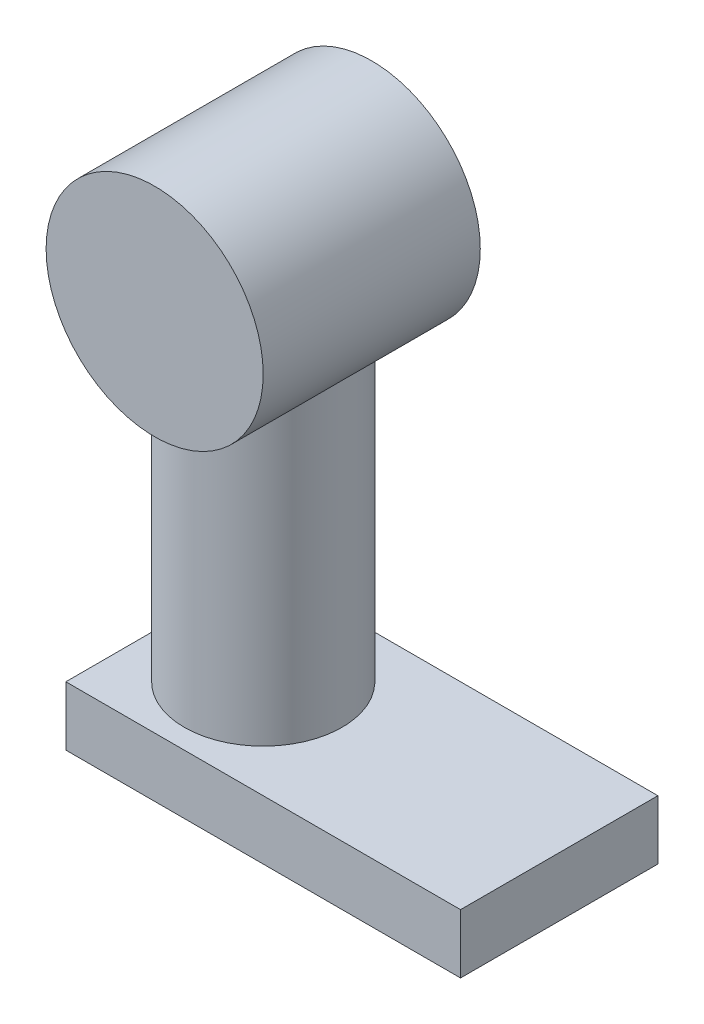
ISO-10303-21;
HEADER;
FILE_DESCRIPTION(('STEP AP214'),'2;1');
FILE_NAME('part.step','',(''),(''),'','','');
FILE_SCHEMA(('AUTOMOTIVE_DESIGN { 1 0 10303 214 1 1 1 1 }'));
ENDSEC;
DATA;
#1=APPLICATION_CONTEXT('core data for automotive mechanical design processes');
#2=APPLICATION_PROTOCOL_DEFINITION('international standard','automotive_design',2000,#1);
#3=PRODUCT_CONTEXT('',#1,'mechanical');
#4=PRODUCT('Part','Part','',(#3));
#5=PRODUCT_RELATED_PRODUCT_CATEGORY('part','',(#4));
#6=PRODUCT_DEFINITION_FORMATION('','',#4);
#7=PRODUCT_DEFINITION_CONTEXT('part definition',#1,'design');
#8=PRODUCT_DEFINITION('design','',#6,#7);
#9=PRODUCT_DEFINITION_SHAPE('','',#8);
#10=(LENGTH_UNIT() NAMED_UNIT(*) SI_UNIT(.MILLI.,.METRE.));
#11=(NAMED_UNIT(*) PLANE_ANGLE_UNIT() SI_UNIT($,.RADIAN.));
#12=(NAMED_UNIT(*) SI_UNIT($,.STERADIAN.) SOLID_ANGLE_UNIT());
#13=UNCERTAINTY_MEASURE_WITH_UNIT(LENGTH_MEASURE(1.E-05),#10,'distance_accuracy_value','');
#14=(GEOMETRIC_REPRESENTATION_CONTEXT(3) GLOBAL_UNCERTAINTY_ASSIGNED_CONTEXT((#13)) GLOBAL_UNIT_ASSIGNED_CONTEXT((#10,
#11,#12)) REPRESENTATION_CONTEXT('',''));
#15=CARTESIAN_POINT('',(0.,0.,0.));
#16=DIRECTION('',(0.,0.,1.));
#17=DIRECTION('',(1.,0.,0.));
#18=AXIS2_PLACEMENT_3D('',#15,#16,#17);
#19=CARTESIAN_POINT('',(0.,190.,0.));
#20=DIRECTION('',(0.,-1.,0.));
#21=DIRECTION('',(0.,0.,-1.));
#22=AXIS2_PLACEMENT_3D('',#19,#20,#21);
#23=CYLINDRICAL_SURFACE('',#22,40.);
#24=CARTESIAN_POINT('',(0.,0.,0.));
#25=DIRECTION('',(0.,1.,0.));
#26=DIRECTION('',(0.,0.,1.));
#27=AXIS2_PLACEMENT_3D('',#24,#25,#26);
#28=CIRCLE('',#27,40.);
#29=CARTESIAN_POINT('',(0.,0.,40.));
#30=VERTEX_POINT('',#29);
#31=EDGE_CURVE('E112',#30,#30,#28,.T.);
#32=ORIENTED_EDGE('',*,*,#31,.T.);
#33=EDGE_LOOP('',(#32));
#34=FACE_BOUND('',#33,.T.);
#35=CARTESIAN_POINT('',(0.,135.,-40.));
#36=CARTESIAN_POINT('',(-0.984083742583215,135.00000931002,-39.9999902940931));
#37=CARTESIAN_POINT('',(-1.96845942739344,135.026477726352,-39.9636172994544));
#38=CARTESIAN_POINT('',(-3.92950238920122,135.131754045187,-39.8186742661435));
#39=CARTESIAN_POINT('',(-4.90616440624865,135.21059498677,-39.710058653338));
#40=CARTESIAN_POINT('',(-6.84582731507095,135.418976216816,-39.4220504754723));
#41=CARTESIAN_POINT('',(-7.80879149667945,135.548633037736,-39.2424952218764));
#42=CARTESIAN_POINT('',(-9.71153540172042,135.855611311634,-38.8154201060335));
#43=CARTESIAN_POINT('',(-10.6513184569501,136.032925870721,-38.5679100736179));
#44=CARTESIAN_POINT('',(-12.4963105620617,136.430162785462,-38.0100717683725));
#45=CARTESIAN_POINT('',(-13.4016930494896,136.649823445595,-37.700128823306));
#46=CARTESIAN_POINT('',(-15.1790040897252,137.128033142359,-37.0203084816768));
#47=CARTESIAN_POINT('',(-16.0509315371191,137.386583462586,-36.650429106814));
#48=CARTESIAN_POINT('',(-17.7571209880402,137.937652462975,-35.8548505946256));
#49=CARTESIAN_POINT('',(-18.5914017135284,138.230153994568,-35.4291796234091));
#50=CARTESIAN_POINT('',(-20.2199651194613,138.844252470265,-34.5256472619918));
#51=CARTESIAN_POINT('',(-21.0142462581761,139.16585053452,-34.0477838623506));
#52=CARTESIAN_POINT('',(-22.631052601757,139.863392638969,-32.9976851621558));
#53=CARTESIAN_POINT('',(-23.4495841858654,140.241619495102,-32.4208200787252));
#54=CARTESIAN_POINT('',(-25.0346902011095,141.019962768002,-31.2130949131306));
#55=CARTESIAN_POINT('',(-25.8012619287169,141.420080321811,-30.5822320252603));
#56=CARTESIAN_POINT('',(-27.2821499067781,142.235997246288,-29.2688447421776));
#57=CARTESIAN_POINT('',(-27.996388019762,142.651818715559,-28.5862460735351));
#58=CARTESIAN_POINT('',(-29.3702474616727,143.491539891531,-27.1727812991901));
#59=CARTESIAN_POINT('',(-30.0298658311716,143.915440034425,-26.4419125819533));
#60=CARTESIAN_POINT('',(-31.4141225424035,144.845000081378,-24.7896373262374));
#61=CARTESIAN_POINT('',(-32.1271031211005,145.350806206186,-23.8585070711959));
#62=CARTESIAN_POINT('',(-33.4716857253963,146.349709637656,-21.9323097161551));
#63=CARTESIAN_POINT('',(-34.1032646337419,146.842803302445,-20.9372245733254));
#64=CARTESIAN_POINT('',(-35.2806140590628,147.799845645979,-18.8858513883336));
#65=CARTESIAN_POINT('',(-35.8264831889204,148.263827444503,-17.8296356240472));
#66=CARTESIAN_POINT('',(-36.8279330348017,149.144794049643,-15.6567168894765));
#67=CARTESIAN_POINT('',(-37.2835638539282,149.561804880206,-14.5400479257497));
#68=CARTESIAN_POINT('',(-37.9634375817883,150.201530633696,-12.6270123793094));
#69=CARTESIAN_POINT('',(-38.2144533844756,150.442989368965,-11.8463520634355));
#70=CARTESIAN_POINT('',(-38.6702526996236,150.888452932553,-10.2611573045912));
#71=CARTESIAN_POINT('',(-38.8750434890422,151.092463655167,-9.45662664199647));
#72=CARTESIAN_POINT('',(-39.2353395209577,151.455821931767,-7.82828206720554));
#73=CARTESIAN_POINT('',(-39.3909383879847,151.615254261888,-7.00450802993215));
#74=CARTESIAN_POINT('',(-39.6507989208522,151.883740755421,-5.34068387646976));
#75=CARTESIAN_POINT('',(-39.7550607645902,151.992795093407,-4.50063381669228));
#76=CARTESIAN_POINT('',(-39.9107642108996,152.156322682179,-2.80391056159339));
#77=CARTESIAN_POINT('',(-39.9618059424068,152.210382658279,-1.94716010557524));
#78=CARTESIAN_POINT('',(-40.0085507064504,152.259874475409,-0.230466459762982));
#79=CARTESIAN_POINT('',(-40.0042557612266,152.255308458885,0.629476612211085));
#80=CARTESIAN_POINT('',(-39.9404088821416,152.187755426789,2.34551841233593));
#81=CARTESIAN_POINT('',(-39.8808219208721,152.124731378153,3.20161435785249));
#82=CARTESIAN_POINT('',(-39.7076543470777,151.943230286969,4.90236277794477));
#83=CARTESIAN_POINT('',(-39.5940676877472,151.824747034206,5.74701396005593));
#84=CARTESIAN_POINT('',(-39.2990373119382,151.520973876187,7.51524446966263));
#85=CARTESIAN_POINT('',(-39.1112864884088,151.329562716877,8.43671416587171));
#86=CARTESIAN_POINT('',(-38.6751332683911,150.893365459594,10.2521301425451));
#87=CARTESIAN_POINT('',(-38.4267220687047,150.648571615132,11.1460724069307));
#88=CARTESIAN_POINT('',(-37.8725438216816,150.114934113766,12.9043335808587));
#89=CARTESIAN_POINT('',(-37.5666678432927,149.826006994917,13.7685924801178));
#90=CARTESIAN_POINT('',(-36.9013028846565,149.213994637341,15.4636044217148));
#91=CARTESIAN_POINT('',(-36.5418088728726,148.890906193731,16.2943543102495));
#92=CARTESIAN_POINT('',(-35.6423591066096,148.106231415448,18.1953233291892));
#93=CARTESIAN_POINT('',(-35.082398351468,147.634642618324,19.2519831363343));
#94=CARTESIAN_POINT('',(-33.876710130668,146.664474317796,21.3021949189188));
#95=CARTESIAN_POINT('',(-33.2309560065999,146.165886453668,22.2957271364158));
#96=CARTESIAN_POINT('',(-31.8565576842253,145.157084038986,24.2189540117851));
#97=CARTESIAN_POINT('',(-31.1278393640127,144.646859422508,25.1485903758414));
#98=CARTESIAN_POINT('',(-29.5904581506682,143.629161449883,26.9406440874283));
#99=CARTESIAN_POINT('',(-28.7818040759834,143.121687796754,27.8030688309587));
#100=CARTESIAN_POINT('',(-27.0756276983558,142.115727434694,29.4677573969908));
#101=CARTESIAN_POINT('',(-26.1771088456024,141.617436182904,30.2691200546357));
#102=CARTESIAN_POINT('',(-24.3020076221987,140.648952399852,31.7942250097455));
#103=CARTESIAN_POINT('',(-23.3254171001158,140.178762811654,32.5179591835286));
#104=CARTESIAN_POINT('',(-21.2993116621298,139.279536450253,33.879582855428));
#105=CARTESIAN_POINT('',(-20.2499423300872,138.850421387195,34.5176366392099));
#106=CARTESIAN_POINT('',(-18.0814849277242,138.044284445287,35.7013186746624));
#107=CARTESIAN_POINT('',(-16.962423316767,137.667242969022,36.2469817143061));
#108=CARTESIAN_POINT('',(-14.9567858102839,137.065201060577,37.1101366083102));
#109=CARTESIAN_POINT('',(-14.0841401929184,136.826000918132,37.4502634620062));
#110=CARTESIAN_POINT('',(-12.3082472760284,136.38709968006,38.070871883185));
#111=CARTESIAN_POINT('',(-11.4050048959485,136.18739226964,38.3513629868175));
#112=CARTESIAN_POINT('',(-9.57336125295663,135.831553121726,38.8490784253834));
#113=CARTESIAN_POINT('',(-8.64497418554997,135.67539733731,39.0663376765226));
#114=CARTESIAN_POINT('',(-6.76851043278085,135.409844746621,39.4347737290875));
#115=CARTESIAN_POINT('',(-5.8204332271617,135.300449177508,39.5859487820907));
#116=CARTESIAN_POINT('',(-3.90794254843092,135.130582967944,39.8203401182266));
#117=CARTESIAN_POINT('',(-2.94348159997997,135.070294902464,39.9033028077818));
#118=CARTESIAN_POINT('',(-1.00923210454746,135.000745972243,39.9989878625757));
#119=CARTESIAN_POINT('',(-0.0394435668258442,134.99148501884,40.0117103498608));
#120=CARTESIAN_POINT('',(1.89766015896868,135.024211414067,39.9667056829631));
#121=CARTESIAN_POINT('',(2.86497523777325,135.06620098886,39.9089754685338));
#122=CARTESIAN_POINT('',(4.78937055776542,135.200435850959,39.7240013089528));
#123=CARTESIAN_POINT('',(5.74645106502032,135.29267982855,39.5967591753979));
#124=CARTESIAN_POINT('',(7.58961083164942,135.518711207721,39.2838618546934));
#125=CARTESIAN_POINT('',(8.47664865263909,135.649860065937,39.1019088152028));
#126=CARTESIAN_POINT('',(10.2298040660314,135.952406439841,38.6802782631014));
#127=CARTESIAN_POINT('',(11.0959226209245,136.123802099878,38.4406034118457));
#128=CARTESIAN_POINT('',(12.8027307734777,136.503695060635,37.9063308163766));
#129=CARTESIAN_POINT('',(13.6434179457767,136.712195887062,37.6117278528059));
#130=CARTESIAN_POINT('',(15.295516076482,137.16269823467,36.970697005011));
#131=CARTESIAN_POINT('',(16.1069253549971,137.404701674306,36.6242661528844));
#132=CARTESIAN_POINT('',(17.7638044914856,137.939775235136,35.8517920938781));
#133=CARTESIAN_POINT('',(18.6064683615178,138.235421347321,35.4215182267594));
#134=CARTESIAN_POINT('',(20.2509483317926,138.856361449487,34.5077400843411));
#135=CARTESIAN_POINT('',(21.0527625915953,139.181656773446,34.0242334137857));
#136=CARTESIAN_POINT('',(22.6138226265481,139.856819190583,33.0073213619786));
#137=CARTESIAN_POINT('',(23.3730464529004,140.206698747693,32.4738906236204));
#138=CARTESIAN_POINT('',(24.8469765033225,140.925564421138,31.3604996853284));
#139=CARTESIAN_POINT('',(25.5616804001884,141.294551534444,30.7805370566386));
#140=CARTESIAN_POINT('',(27.0720164439221,142.115000637728,29.4666380253121));
#141=CARTESIAN_POINT('',(27.858550782706,142.569206386649,28.7239380728747));
#142=CARTESIAN_POINT('',(29.3663192451618,143.487649902064,27.1805720348684));
#143=CARTESIAN_POINT('',(30.0875430273704,143.951889242943,26.3798968053211));
#144=CARTESIAN_POINT('',(31.4636435001538,144.880948701106,24.7224655459643));
#145=CARTESIAN_POINT('',(32.1184669911531,145.345768986702,23.865665439747));
#146=CARTESIAN_POINT('',(33.3591481305627,146.264854286642,22.0982543018373));
#147=CARTESIAN_POINT('',(33.9450152265263,146.719120740079,21.1876506673768));
#148=CARTESIAN_POINT('',(34.978944960672,147.551684178397,19.4264457959636));
#149=CARTESIAN_POINT('',(35.435106650534,147.932545020811,18.5818097841104));
#150=CARTESIAN_POINT('',(36.2895403121949,148.667364942148,16.8522842226466));
#151=CARTESIAN_POINT('',(36.6878107233613,149.021323295712,15.9673935886964));
#152=CARTESIAN_POINT('',(37.4224543500141,149.691109320759,14.1601455344872));
#153=CARTESIAN_POINT('',(37.7589318409651,150.0070009142,13.237854499644));
#154=CARTESIAN_POINT('',(38.3666088586499,150.589585726889,11.3569021294121));
#155=CARTESIAN_POINT('',(38.6378274693497,150.856293323905,10.3982515219909));
#156=CARTESIAN_POINT('',(39.0594306885389,151.277531537531,8.6591000987915));
#157=CARTESIAN_POINT('',(39.2232591370243,151.44385062163,7.88470267284146));
#158=CARTESIAN_POINT('',(39.5056120989986,151.733204668429,6.31969220988486));
#159=CARTESIAN_POINT('',(39.6241426000355,151.856245351559,5.52908133056268));
#160=CARTESIAN_POINT('',(39.8138223571939,152.054269677287,3.93715998360442));
#161=CARTESIAN_POINT('',(39.8850293180351,152.129311843436,3.13586376660023));
#162=CARTESIAN_POINT('',(39.9789514192686,152.228473876246,1.527244723669));
#163=CARTESIAN_POINT('',(40.0016662593813,152.252593427579,0.719921860454019));
#164=CARTESIAN_POINT('',(39.9981406394522,152.248857605241,-0.895698968093946));
#165=CARTESIAN_POINT('',(39.9718271928458,152.220924743095,-1.70399659420351));
#166=CARTESIAN_POINT('',(39.870634337519,152.114147204286,-3.31410431881588));
#167=CARTESIAN_POINT('',(39.7957551057039,152.035302713075,-4.11591444093923));
#168=CARTESIAN_POINT('',(39.5987022171097,151.829816016219,-5.70855235496697));
#169=CARTESIAN_POINT('',(39.4764644506807,151.703109024543,-6.49936374807431));
#170=CARTESIAN_POINT('',(39.1867177267001,151.406685033963,-8.06441906469509));
#171=CARTESIAN_POINT('',(39.0192025550863,151.236962131574,-8.83866069835263));
#172=CARTESIAN_POINT('',(38.5835505523884,150.802667778316,-10.6002223377417));
#173=CARTESIAN_POINT('',(38.30030677156,150.52495346972,-11.5805831215977));
#174=CARTESIAN_POINT('',(37.6656268807619,149.918922164229,-13.502816267676));
#175=CARTESIAN_POINT('',(37.3141677400959,149.590588084937,-14.4446755007234));
#176=CARTESIAN_POINT('',(36.5469985672202,148.895436966274,-16.2885006027404));
#177=CARTESIAN_POINT('',(36.1312071906264,148.52857139735,-17.1904140793396));
#178=CARTESIAN_POINT('',(35.2392312936875,147.768020603174,-18.9518120635604));
#179=CARTESIAN_POINT('',(34.7630508771011,147.374337201178,-19.811299448754));
#180=CARTESIAN_POINT('',(33.7380714559816,146.558267131412,-21.5117820129858));
#181=CARTESIAN_POINT('',(33.1875535381244,146.135377433132,-22.3514975324299));
#182=CARTESIAN_POINT('',(32.0273357100645,145.281225587644,-23.9844304323203));
#183=CARTESIAN_POINT('',(31.4176359117793,144.84996345627,-24.7776479006934));
#184=CARTESIAN_POINT('',(30.140308856891,143.987437656096,-26.3165732591513));
#185=CARTESIAN_POINT('',(29.4726609046776,143.556174042209,-27.0622640092717));
#186=CARTESIAN_POINT('',(28.08078651305,142.70162259996,-28.5039189650456));
#187=CARTESIAN_POINT('',(27.356553951291,142.278335640824,-29.1998777741589));
#188=CARTESIAN_POINT('',(25.688944964575,141.356681269118,-30.6852050863007));
#189=CARTESIAN_POINT('',(24.7321824359606,140.86202725013,-31.4619300023669));
#190=CARTESIAN_POINT('',(22.7387857444067,139.908404677621,-32.9314483813547));
#191=CARTESIAN_POINT('',(21.7021336687295,139.449444173876,-33.6242229309275));
#192=CARTESIAN_POINT('',(20.0914793142173,138.797772478309,-34.5937134750296));
#193=CARTESIAN_POINT('',(19.5454905018004,138.586735636116,-34.9051805606355));
#194=CARTESIAN_POINT('',(18.4354779314548,138.17835729786,-35.5039526318117));
#195=CARTESIAN_POINT('',(17.8714568082006,137.981013814317,-35.7912611250919));
#196=CARTESIAN_POINT('',(16.7264205671935,137.601617509656,-36.3404717059895));
#197=CARTESIAN_POINT('',(16.1454116160143,137.419559230686,-36.6023828673942));
#198=CARTESIAN_POINT('',(14.9673578077662,137.072168208494,-37.0996902294464));
#199=CARTESIAN_POINT('',(14.3703145602433,136.906833794389,-37.3350890792085));
#200=CARTESIAN_POINT('',(12.900977409113,136.526996169125,-37.8736421425356));
#201=CARTESIAN_POINT('',(12.0208457381668,136.321970172309,-38.1623342945053));
#202=CARTESIAN_POINT('',(10.2347095879488,135.952961913456,-38.679648092251));
#203=CARTESIAN_POINT('',(9.32870585941996,135.788978461812,-38.9082714791137));
#204=CARTESIAN_POINT('',(7.4986639194961,135.505733569173,-39.3019556815652));
#205=CARTESIAN_POINT('',(6.57468004541536,135.386354414124,-39.4671838333671));
#206=CARTESIAN_POINT('',(4.71295523004042,135.194317811035,-39.7324960310419));
#207=CARTESIAN_POINT('',(3.77522205318846,135.121634959125,-39.8326154979086));
#208=CARTESIAN_POINT('',(2.36296728113428,135.04875476846,-39.9329410764714));
#209=CARTESIAN_POINT('',(1.89097331721055,135.030485290341,-39.9580740893672));
#210=CARTESIAN_POINT('',(0.946008813273771,135.00610473886,-39.9916071633038));
#211=CARTESIAN_POINT('',(0.473038134988297,134.999995524777,-40.0000046655218));
#212=CARTESIAN_POINT('',(0.,135.,-40.));
#213=B_SPLINE_CURVE_WITH_KNOTS('',3,(#35,#36,#37,#38,#39,#40,#41,#42,#43,#44,#45,#46,#47,#48,
#49,#50,#51,#52,#53,#54,#55,#56,#57,#58,#59,#60,#61,#62,#63,#64,#65,#66,#67,#68,#69,#70,#71,#72,
#73,#74,#75,#76,#77,#78,#79,#80,#81,#82,#83,#84,#85,#86,#87,#88,#89,#90,#91,#92,#93,#94,#95,#96,
#97,#98,#99,#100,#101,#102,#103,#104,#105,#106,#107,#108,#109,#110,#111,#112,#113,#114,#115,
#116,#117,#118,#119,#120,#121,#122,#123,#124,#125,#126,#127,#128,#129,#130,#131,#132,#133,#134,
#135,#136,#137,#138,#139,#140,#141,#142,#143,#144,#145,#146,#147,#148,#149,#150,#151,#152,#153,
#154,#155,#156,#157,#158,#159,#160,#161,#162,#163,#164,#165,#166,#167,#168,#169,#170,#171,#172,
#173,#174,#175,#176,#177,#178,#179,#180,#181,#182,#183,#184,#185,#186,#187,#188,#189,#190,#191,
#192,#193,#194,#195,#196,#197,#198,#199,#200,#201,#202,#203,#204,#205,#206,#207,#208,#209,#210,
#211,#212),.UNSPECIFIED.,.T.,.F.,(4,2,2,2,2,2,2,2,2,2,2,2,2,2,2,2,2,2,2,2,2,2,2,2,2,2,2,2,2,2,2,
2,2,2,2,2,2,2,2,2,2,2,2,2,2,2,2,2,2,2,2,2,2,2,2,2,2,2,2,2,2,2,2,2,2,2,2,2,2,2,2,2,2,2,2,2,2,2,2,
2,2,2,2,2,2,2,2,2,4),(0.,2.95173917730087,5.90534222264732,8.86575856558531,11.8257469021944,
14.7679974475686,17.710345126535,20.6512130567051,23.5921942520276,26.8004603035288,
30.0088931566882,33.2220227117342,36.4353262480345,40.2625948314699,44.0909479368388,
47.914863556808,51.7366500313104,54.2990762707271,56.8610988392477,59.4182154662053,
61.9753232319651,64.551508419604,67.1275994626464,69.7053235704188,72.2833363959059,
75.1581747421181,78.0334305408623,80.9141927390879,83.7952254394184,87.6463836559451,
91.4987413465614,95.3545682283973,99.2099702122851,103.114242790993,107.018923547028,
110.916007080666,114.811619962814,117.708723813354,120.605364048879,123.500401731058,
126.395516004052,129.301345407836,132.207169762574,135.113120341786,138.018995190681,
140.760862924012,143.502604263414,146.24460626038,148.986765337096,151.957697201755,
154.928762800736,157.901345719348,160.874083894525,164.390387919813,167.907247756862,
171.426903383169,174.946076227029,178.041778106951,181.137563425298,184.228075618589,
187.317682937221,189.741812662044,192.16562185099,194.586470079897,197.007333299467,
199.431803246621,201.856264362471,204.284019024565,206.712107051295,209.880052177601,
213.049068723807,216.222125557922,219.394966881246,222.660771378422,225.926569699836,
229.193539206264,232.460862683266,236.439406090856,240.418844172702,242.407348246858,
244.39556309956,246.3830649787,248.370368089797,251.213267314964,254.056084129906,
256.891344641328,259.725061396389,261.143712772353,262.562581040349),.UNSPECIFIED.);
#214=CARTESIAN_POINT('',(0.,135.,-40.));
#215=VERTEX_POINT('',#214);
#216=EDGE_CURVE('E11',#215,#215,#213,.T.);
#217=ORIENTED_EDGE('',*,*,#216,.F.);
#218=EDGE_LOOP('',(#217));
#219=FACE_BOUND('',#218,.T.);
#220=ADVANCED_FACE('F32',(#34,#219),#23,.T.);
#221=CARTESIAN_POINT('',(0.,190.,55.));
#222=DIRECTION('',(0.,0.,-1.));
#223=DIRECTION('',(-1.,0.,0.));
#224=AXIS2_PLACEMENT_3D('',#221,#222,#223);
#225=CYLINDRICAL_SURFACE('',#224,55.);
#226=CARTESIAN_POINT('',(0.,190.,-55.));
#227=DIRECTION('',(0.,0.,1.));
#228=DIRECTION('',(1.,0.,0.));
#229=AXIS2_PLACEMENT_3D('',#226,#227,#228);
#230=CIRCLE('',#229,55.);
#231=CARTESIAN_POINT('',(55.,190.,-55.));
#232=VERTEX_POINT('',#231);
#233=EDGE_CURVE('E115',#232,#232,#230,.T.);
#234=ORIENTED_EDGE('',*,*,#233,.T.);
#235=EDGE_LOOP('',(#234));
#236=FACE_BOUND('',#235,.T.);
#237=CARTESIAN_POINT('',(0.,190.,55.));
#238=DIRECTION('',(0.,0.,1.));
#239=DIRECTION('',(1.,0.,0.));
#240=AXIS2_PLACEMENT_3D('',#237,#238,#239);
#241=CIRCLE('',#240,55.);
#242=CARTESIAN_POINT('',(55.,190.,55.));
#243=VERTEX_POINT('',#242);
#244=EDGE_CURVE('E44',#243,#243,#241,.T.);
#245=ORIENTED_EDGE('',*,*,#244,.F.);
#246=EDGE_LOOP('',(#245));
#247=FACE_BOUND('',#246,.T.);
#248=ORIENTED_EDGE('',*,*,#216,.T.);
#249=EDGE_LOOP('',(#248));
#250=FACE_BOUND('',#249,.T.);
#251=ADVANCED_FACE('F139',(#236,#247,#250),#225,.T.);
#252=CARTESIAN_POINT('',(0.,190.,55.));
#253=DIRECTION('',(0.,0.,1.));
#254=DIRECTION('',(1.,0.,0.));
#255=AXIS2_PLACEMENT_3D('',#252,#253,#254);
#256=PLANE('',#255);
#257=ORIENTED_EDGE('',*,*,#244,.T.);
#258=EDGE_LOOP('',(#257));
#259=FACE_BOUND('',#258,.T.);
#260=ADVANCED_FACE('F143',(#259),#256,.T.);
#261=CARTESIAN_POINT('',(0.,190.,-55.));
#262=DIRECTION('',(0.,0.,1.));
#263=DIRECTION('',(1.,0.,0.));
#264=AXIS2_PLACEMENT_3D('',#261,#262,#263);
#265=PLANE('',#264);
#266=ORIENTED_EDGE('',*,*,#233,.F.);
#267=EDGE_LOOP('',(#266));
#268=FACE_BOUND('',#267,.T.);
#269=ADVANCED_FACE('F148',(#268),#265,.F.);
#270=CARTESIAN_POINT('',(-50.,-30.,50.));
#271=DIRECTION('',(1.,0.,0.));
#272=DIRECTION('',(0.,0.,-1.));
#273=AXIS2_PLACEMENT_3D('',#270,#271,#272);
#274=PLANE('',#273);
#275=DIRECTION('',(0.,0.,-1.));
#276=VECTOR('',#275,1.);
#277=CARTESIAN_POINT('',(-50.,0.,50.));
#278=LINE('',#277,#276);
#279=CARTESIAN_POINT('',(-50.,0.,50.));
#280=VERTEX_POINT('',#279);
#281=CARTESIAN_POINT('',(-50.,0.,-50.));
#282=VERTEX_POINT('',#281);
#283=EDGE_CURVE('E103',#280,#282,#278,.T.);
#284=ORIENTED_EDGE('',*,*,#283,.T.);
#285=DIRECTION('',(0.,1.,0.));
#286=VECTOR('',#285,1.);
#287=CARTESIAN_POINT('',(-50.,-30.,-50.));
#288=LINE('',#287,#286);
#289=CARTESIAN_POINT('',(-50.,-30.,-50.));
#290=VERTEX_POINT('',#289);
#291=EDGE_CURVE('E94',#290,#282,#288,.T.);
#292=ORIENTED_EDGE('',*,*,#291,.F.);
#293=DIRECTION('',(0.,0.,-1.));
#294=VECTOR('',#293,1.);
#295=CARTESIAN_POINT('',(-50.,-30.,50.));
#296=LINE('',#295,#294);
#297=CARTESIAN_POINT('',(-50.,-30.,50.));
#298=VERTEX_POINT('',#297);
#299=EDGE_CURVE('E88',#298,#290,#296,.T.);
#300=ORIENTED_EDGE('',*,*,#299,.F.);
#301=DIRECTION('',(0.,1.,0.));
#302=VECTOR('',#301,1.);
#303=CARTESIAN_POINT('',(-50.,-30.,50.));
#304=LINE('',#303,#302);
#305=EDGE_CURVE('E99',#298,#280,#304,.T.);
#306=ORIENTED_EDGE('',*,*,#305,.T.);
#307=EDGE_LOOP('',(#284,#292,#300,#306));
#308=FACE_BOUND('',#307,.T.);
#309=ADVANCED_FACE('F128',(#308),#274,.F.);
#310=CARTESIAN_POINT('',(-50.,-30.,-50.));
#311=DIRECTION('',(0.,0.,1.));
#312=DIRECTION('',(1.,0.,0.));
#313=AXIS2_PLACEMENT_3D('',#310,#311,#312);
#314=PLANE('',#313);
#315=DIRECTION('',(1.,0.,0.));
#316=VECTOR('',#315,1.);
#317=CARTESIAN_POINT('',(-50.,0.,-50.));
#318=LINE('',#317,#316);
#319=CARTESIAN_POINT('',(150.,0.,-50.));
#320=VERTEX_POINT('',#319);
#321=EDGE_CURVE('E93',#282,#320,#318,.T.);
#322=ORIENTED_EDGE('',*,*,#321,.T.);
#323=DIRECTION('',(0.,1.,0.));
#324=VECTOR('',#323,1.);
#325=CARTESIAN_POINT('',(150.,-30.,-50.));
#326=LINE('',#325,#324);
#327=CARTESIAN_POINT('',(150.,-30.,-50.));
#328=VERTEX_POINT('',#327);
#329=EDGE_CURVE('E91',#328,#320,#326,.T.);
#330=ORIENTED_EDGE('',*,*,#329,.F.);
#331=DIRECTION('',(1.,0.,0.));
#332=VECTOR('',#331,1.);
#333=CARTESIAN_POINT('',(-50.,-30.,-50.));
#334=LINE('',#333,#332);
#335=EDGE_CURVE('E83',#290,#328,#334,.T.);
#336=ORIENTED_EDGE('',*,*,#335,.F.);
#337=ORIENTED_EDGE('',*,*,#291,.T.);
#338=EDGE_LOOP('',(#322,#330,#336,#337));
#339=FACE_BOUND('',#338,.T.);
#340=ADVANCED_FACE('F92',(#339),#314,.F.);
#341=CARTESIAN_POINT('',(150.,-30.,50.));
#342=DIRECTION('',(-1.,0.,0.));
#343=DIRECTION('',(0.,0.,1.));
#344=AXIS2_PLACEMENT_3D('',#341,#342,#343);
#345=PLANE('',#344);
#346=DIRECTION('',(0.,0.,1.));
#347=VECTOR('',#346,1.);
#348=CARTESIAN_POINT('',(150.,0.,50.));
#349=LINE('',#348,#347);
#350=CARTESIAN_POINT('',(150.,0.,50.));
#351=VERTEX_POINT('',#350);
#352=EDGE_CURVE('E69',#320,#351,#349,.T.);
#353=ORIENTED_EDGE('',*,*,#352,.T.);
#354=DIRECTION('',(0.,1.,0.));
#355=VECTOR('',#354,1.);
#356=CARTESIAN_POINT('',(150.,-30.,50.));
#357=LINE('',#356,#355);
#358=CARTESIAN_POINT('',(150.,-30.,50.));
#359=VERTEX_POINT('',#358);
#360=EDGE_CURVE('E95',#359,#351,#357,.T.);
#361=ORIENTED_EDGE('',*,*,#360,.F.);
#362=DIRECTION('',(0.,0.,1.));
#363=VECTOR('',#362,1.);
#364=CARTESIAN_POINT('',(150.,-30.,50.));
#365=LINE('',#364,#363);
#366=EDGE_CURVE('E86',#328,#359,#365,.T.);
#367=ORIENTED_EDGE('',*,*,#366,.F.);
#368=ORIENTED_EDGE('',*,*,#329,.T.);
#369=EDGE_LOOP('',(#353,#361,#367,#368));
#370=FACE_BOUND('',#369,.T.);
#371=ADVANCED_FACE('F97',(#370),#345,.F.);
#372=CARTESIAN_POINT('',(-50.,-30.,50.));
#373=DIRECTION('',(0.,0.,-1.));
#374=DIRECTION('',(-1.,0.,0.));
#375=AXIS2_PLACEMENT_3D('',#372,#373,#374);
#376=PLANE('',#375);
#377=DIRECTION('',(-1.,0.,0.));
#378=VECTOR('',#377,1.);
#379=CARTESIAN_POINT('',(-50.,0.,50.));
#380=LINE('',#379,#378);
#381=EDGE_CURVE('E75',#351,#280,#380,.T.);
#382=ORIENTED_EDGE('',*,*,#381,.T.);
#383=ORIENTED_EDGE('',*,*,#305,.F.);
#384=DIRECTION('',(-1.,0.,0.));
#385=VECTOR('',#384,1.);
#386=CARTESIAN_POINT('',(-50.,-30.,50.));
#387=LINE('',#386,#385);
#388=EDGE_CURVE('E52',#359,#298,#387,.T.);
#389=ORIENTED_EDGE('',*,*,#388,.F.);
#390=ORIENTED_EDGE('',*,*,#360,.T.);
#391=EDGE_LOOP('',(#382,#383,#389,#390));
#392=FACE_BOUND('',#391,.T.);
#393=ADVANCED_FACE('F129',(#392),#376,.F.);
#394=CARTESIAN_POINT('',(0.,-30.,0.));
#395=DIRECTION('',(0.,-1.,0.));
#396=DIRECTION('',(0.,0.,-1.));
#397=AXIS2_PLACEMENT_3D('',#394,#395,#396);
#398=PLANE('',#397);
#399=ORIENTED_EDGE('',*,*,#299,.T.);
#400=ORIENTED_EDGE('',*,*,#335,.T.);
#401=ORIENTED_EDGE('',*,*,#366,.T.);
#402=ORIENTED_EDGE('',*,*,#388,.T.);
#403=EDGE_LOOP('',(#399,#400,#401,#402));
#404=FACE_BOUND('',#403,.T.);
#405=ADVANCED_FACE('F84',(#404),#398,.T.);
#406=CARTESIAN_POINT('',(0.,0.,0.));
#407=DIRECTION('',(0.,-1.,0.));
#408=DIRECTION('',(0.,0.,-1.));
#409=AXIS2_PLACEMENT_3D('',#406,#407,#408);
#410=PLANE('',#409);
#411=ORIENTED_EDGE('',*,*,#31,.F.);
#412=EDGE_LOOP('',(#411));
#413=FACE_BOUND('',#412,.T.);
#414=ORIENTED_EDGE('',*,*,#283,.F.);
#415=ORIENTED_EDGE('',*,*,#381,.F.);
#416=ORIENTED_EDGE('',*,*,#352,.F.);
#417=ORIENTED_EDGE('',*,*,#321,.F.);
#418=EDGE_LOOP('',(#414,#415,#416,#417));
#419=FACE_BOUND('',#418,.T.);
#420=ADVANCED_FACE('F122',(#413,#419),#410,.F.);
#421=CLOSED_SHELL('',(#220,#251,#260,#269,#309,#340,#371,#393,#405,#420));
#422=MANIFOLD_SOLID_BREP('B2',#421);
#423=ADVANCED_BREP_SHAPE_REPRESENTATION('',(#18,#422),#14);
#424=SHAPE_DEFINITION_REPRESENTATION(#9,#423);
ENDSEC;
END-ISO-10303-21;
